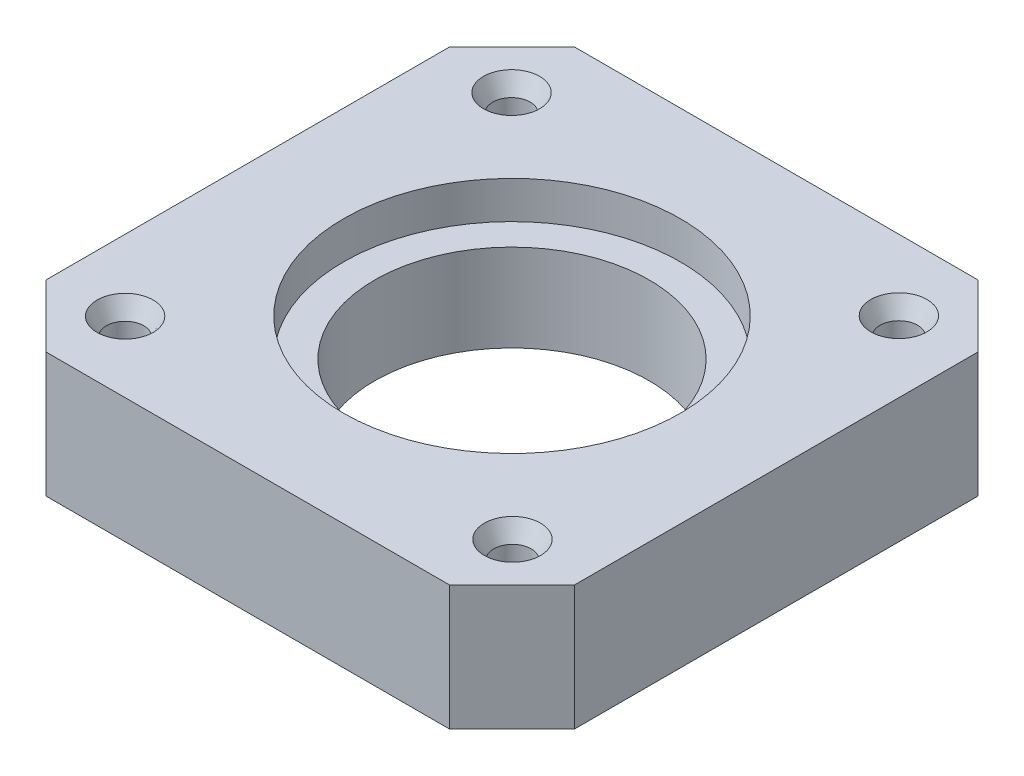
ISO-10303-21;
HEADER;
FILE_DESCRIPTION(('STEP AP214'),'2;1');
FILE_NAME('part.step','',(''),(''),'','','');
FILE_SCHEMA(('AUTOMOTIVE_DESIGN { 1 0 10303 214 1 1 1 1 }'));
ENDSEC;
DATA;
#1=APPLICATION_CONTEXT('core data for automotive mechanical design processes');
#2=APPLICATION_PROTOCOL_DEFINITION('international standard','automotive_design',2000,#1);
#3=PRODUCT_CONTEXT('',#1,'mechanical');
#4=PRODUCT('Part','Part','',(#3));
#5=PRODUCT_RELATED_PRODUCT_CATEGORY('part','',(#4));
#6=PRODUCT_DEFINITION_FORMATION('','',#4);
#7=PRODUCT_DEFINITION_CONTEXT('part definition',#1,'design');
#8=PRODUCT_DEFINITION('design','',#6,#7);
#9=PRODUCT_DEFINITION_SHAPE('','',#8);
#10=(LENGTH_UNIT() NAMED_UNIT(*) SI_UNIT(.MILLI.,.METRE.));
#11=(NAMED_UNIT(*) PLANE_ANGLE_UNIT() SI_UNIT($,.RADIAN.));
#12=(NAMED_UNIT(*) SI_UNIT($,.STERADIAN.) SOLID_ANGLE_UNIT());
#13=UNCERTAINTY_MEASURE_WITH_UNIT(LENGTH_MEASURE(1.E-05),#10,'distance_accuracy_value','');
#14=(GEOMETRIC_REPRESENTATION_CONTEXT(3) GLOBAL_UNCERTAINTY_ASSIGNED_CONTEXT((#13)) GLOBAL_UNIT_ASSIGNED_CONTEXT((#10,
#11,#12)) REPRESENTATION_CONTEXT('',''));
#15=CARTESIAN_POINT('',(0.,0.,0.));
#16=DIRECTION('',(0.,0.,1.));
#17=DIRECTION('',(1.,0.,0.));
#18=AXIS2_PLACEMENT_3D('',#15,#16,#17);
#19=CARTESIAN_POINT('',(0.,10.,0.));
#20=DIRECTION('',(0.,-1.,0.));
#21=DIRECTION('',(0.,0.,-1.));
#22=AXIS2_PLACEMENT_3D('',#19,#20,#21);
#23=CYLINDRICAL_SURFACE('',#22,11.);
#24=CARTESIAN_POINT('',(0.,0.,0.));
#25=DIRECTION('',(0.,1.,0.));
#26=DIRECTION('',(0.,0.,1.));
#27=AXIS2_PLACEMENT_3D('',#24,#25,#26);
#28=CIRCLE('',#27,11.);
#29=CARTESIAN_POINT('',(0.,0.,11.));
#30=VERTEX_POINT('',#29);
#31=EDGE_CURVE('E11',#30,#30,#28,.T.);
#32=ORIENTED_EDGE('',*,*,#31,.F.);
#33=EDGE_LOOP('',(#32));
#34=FACE_BOUND('',#33,.T.);
#35=CARTESIAN_POINT('',(0.,7.,0.));
#36=DIRECTION('',(0.,1.,0.));
#37=DIRECTION('',(0.,0.,1.));
#38=AXIS2_PLACEMENT_3D('',#35,#36,#37);
#39=CIRCLE('',#38,11.);
#40=CARTESIAN_POINT('',(0.,7.,11.));
#41=VERTEX_POINT('',#40);
#42=EDGE_CURVE('E35',#41,#41,#39,.T.);
#43=ORIENTED_EDGE('',*,*,#42,.T.);
#44=EDGE_LOOP('',(#43));
#45=FACE_BOUND('',#44,.T.);
#46=ADVANCED_FACE('F31',(#34,#45),#23,.F.);
#47=CARTESIAN_POINT('',(0.,10.,0.));
#48=DIRECTION('',(0.,1.,0.));
#49=DIRECTION('',(0.,0.,1.));
#50=AXIS2_PLACEMENT_3D('',#47,#48,#49);
#51=PLANE('',#50);
#52=CARTESIAN_POINT('',(0.,10.,0.));
#53=DIRECTION('',(0.,1.,0.));
#54=DIRECTION('',(0.,0.,1.));
#55=AXIS2_PLACEMENT_3D('',#52,#53,#54);
#56=CIRCLE('',#55,13.5);
#57=CARTESIAN_POINT('',(0.,10.,13.5));
#58=VERTEX_POINT('',#57);
#59=EDGE_CURVE('E192',#58,#58,#56,.T.);
#60=ORIENTED_EDGE('',*,*,#59,.F.);
#61=EDGE_LOOP('',(#60));
#62=FACE_BOUND('',#61,.T.);
#63=CARTESIAN_POINT('',(15.5184395783335,10.,15.4815384588745));
#64=DIRECTION('',(0.,1.,0.));
#65=DIRECTION('',(0.,0.,1.));
#66=AXIS2_PLACEMENT_3D('',#63,#64,#65);
#67=CIRCLE('',#66,2.25);
#68=CARTESIAN_POINT('',(15.5184395783335,10.,17.7315384588745));
#69=VERTEX_POINT('',#68);
#70=EDGE_CURVE('E180',#69,#69,#67,.T.);
#71=ORIENTED_EDGE('',*,*,#70,.F.);
#72=EDGE_LOOP('',(#71));
#73=FACE_BOUND('',#72,.T.);
#74=CARTESIAN_POINT('',(15.4815384588745,10.,-15.5184395783335));
#75=DIRECTION('',(0.,1.,0.));
#76=DIRECTION('',(0.,0.,1.));
#77=AXIS2_PLACEMENT_3D('',#74,#75,#76);
#78=CIRCLE('',#77,2.25);
#79=CARTESIAN_POINT('',(15.4815384588745,10.,-13.2684395783335));
#80=VERTEX_POINT('',#79);
#81=EDGE_CURVE('E177',#80,#80,#78,.T.);
#82=ORIENTED_EDGE('',*,*,#81,.F.);
#83=EDGE_LOOP('',(#82));
#84=FACE_BOUND('',#83,.T.);
#85=CARTESIAN_POINT('',(-15.4815384588745,10.,15.5184395783335));
#86=DIRECTION('',(0.,1.,0.));
#87=DIRECTION('',(0.,0.,1.));
#88=AXIS2_PLACEMENT_3D('',#85,#86,#87);
#89=CIRCLE('',#88,2.25);
#90=CARTESIAN_POINT('',(-15.4815384588745,10.,17.7684395783335));
#91=VERTEX_POINT('',#90);
#92=EDGE_CURVE('E174',#91,#91,#89,.T.);
#93=ORIENTED_EDGE('',*,*,#92,.F.);
#94=EDGE_LOOP('',(#93));
#95=FACE_BOUND('',#94,.T.);
#96=CARTESIAN_POINT('',(-15.5184395783335,10.,-15.4815384588745));
#97=DIRECTION('',(0.,1.,0.));
#98=DIRECTION('',(0.,0.,1.));
#99=AXIS2_PLACEMENT_3D('',#96,#97,#98);
#100=CIRCLE('',#99,2.25);
#101=CARTESIAN_POINT('',(-15.5184395783335,10.,-13.2315384588745));
#102=VERTEX_POINT('',#101);
#103=EDGE_CURVE('E170',#102,#102,#100,.T.);
#104=ORIENTED_EDGE('',*,*,#103,.F.);
#105=EDGE_LOOP('',(#104));
#106=FACE_BOUND('',#105,.T.);
#107=DIRECTION('',(-0.707106781186548,0.,-0.707106781186548));
#108=VECTOR('',#107,1.);
#109=CARTESIAN_POINT('',(-21.169262219769,10.,16.169262219769));
#110=LINE('',#109,#108);
#111=CARTESIAN_POINT('',(-16.169262219769,10.,21.169262219769));
#112=VERTEX_POINT('',#111);
#113=CARTESIAN_POINT('',(-21.1692622197689,10.,16.169262219769));
#114=VERTEX_POINT('',#113);
#115=EDGE_CURVE('E115',#112,#114,#110,.T.);
#116=ORIENTED_EDGE('',*,*,#115,.F.);
#117=DIRECTION('',(-1.,0.,0.));
#118=VECTOR('',#117,1.);
#119=CARTESIAN_POINT('',(-16.169262219769,10.,21.169262219769));
#120=LINE('',#119,#118);
#121=CARTESIAN_POINT('',(16.169262219769,10.,21.169262219769));
#122=VERTEX_POINT('',#121);
#123=EDGE_CURVE('E48',#122,#112,#120,.T.);
#124=ORIENTED_EDGE('',*,*,#123,.F.);
#125=DIRECTION('',(-0.707106781186548,0.,0.707106781186548));
#126=VECTOR('',#125,1.);
#127=CARTESIAN_POINT('',(16.169262219769,10.,21.169262219769));
#128=LINE('',#127,#126);
#129=CARTESIAN_POINT('',(21.169262219769,10.,16.169262219769));
#130=VERTEX_POINT('',#129);
#131=EDGE_CURVE('E131',#130,#122,#128,.T.);
#132=ORIENTED_EDGE('',*,*,#131,.F.);
#133=DIRECTION('',(0.,0.,1.));
#134=VECTOR('',#133,1.);
#135=CARTESIAN_POINT('',(21.169262219769,10.,-16.169262219769));
#136=LINE('',#135,#134);
#137=CARTESIAN_POINT('',(21.169262219769,10.,-16.169262219769));
#138=VERTEX_POINT('',#137);
#139=EDGE_CURVE('E128',#138,#130,#136,.T.);
#140=ORIENTED_EDGE('',*,*,#139,.F.);
#141=DIRECTION('',(0.707106781186548,0.,0.707106781186548));
#142=VECTOR('',#141,1.);
#143=CARTESIAN_POINT('',(16.169262219769,10.,-21.169262219769));
#144=LINE('',#143,#142);
#145=CARTESIAN_POINT('',(16.169262219769,10.,-21.169262219769));
#146=VERTEX_POINT('',#145);
#147=EDGE_CURVE('E122',#146,#138,#144,.T.);
#148=ORIENTED_EDGE('',*,*,#147,.F.);
#149=DIRECTION('',(1.,0.,0.));
#150=VECTOR('',#149,1.);
#151=CARTESIAN_POINT('',(-16.169262219769,10.,-21.169262219769));
#152=LINE('',#151,#150);
#153=CARTESIAN_POINT('',(-16.169262219769,10.,-21.169262219769));
#154=VERTEX_POINT('',#153);
#155=EDGE_CURVE('E120',#154,#146,#152,.T.);
#156=ORIENTED_EDGE('',*,*,#155,.F.);
#157=DIRECTION('',(0.707106781186548,0.,-0.707106781186548));
#158=VECTOR('',#157,1.);
#159=CARTESIAN_POINT('',(-16.169262219769,10.,-21.169262219769));
#160=LINE('',#159,#158);
#161=CARTESIAN_POINT('',(-21.169262219769,10.,-16.169262219769));
#162=VERTEX_POINT('',#161);
#163=EDGE_CURVE('E102',#162,#154,#160,.T.);
#164=ORIENTED_EDGE('',*,*,#163,.F.);
#165=DIRECTION('',(0.,0.,-1.));
#166=VECTOR('',#165,1.);
#167=CARTESIAN_POINT('',(-21.169262219769,10.,-16.169262219769));
#168=LINE('',#167,#166);
#169=EDGE_CURVE('E110',#114,#162,#168,.T.);
#170=ORIENTED_EDGE('',*,*,#169,.F.);
#171=EDGE_LOOP('',(#116,#124,#132,#140,#148,#156,#164,#170));
#172=FACE_BOUND('',#171,.T.);
#173=ADVANCED_FACE('F117',(#62,#73,#84,#95,#106,#172),#51,.T.);
#174=CARTESIAN_POINT('',(0.,0.,0.));
#175=DIRECTION('',(0.,1.,0.));
#176=DIRECTION('',(0.,0.,1.));
#177=AXIS2_PLACEMENT_3D('',#174,#175,#176);
#178=PLANE('',#177);
#179=CARTESIAN_POINT('',(15.5184395783335,0.,15.4815384588745));
#180=DIRECTION('',(0.,1.,0.));
#181=DIRECTION('',(0.,0.,1.));
#182=AXIS2_PLACEMENT_3D('',#179,#180,#181);
#183=CIRCLE('',#182,1.5);
#184=CARTESIAN_POINT('',(15.5184395783335,0.,16.9815384588745));
#185=VERTEX_POINT('',#184);
#186=EDGE_CURVE('E169',#185,#185,#183,.T.);
#187=ORIENTED_EDGE('',*,*,#186,.T.);
#188=EDGE_LOOP('',(#187));
#189=FACE_BOUND('',#188,.T.);
#190=CARTESIAN_POINT('',(15.4815384588745,0.,-15.5184395783335));
#191=DIRECTION('',(0.,1.,0.));
#192=DIRECTION('',(0.,0.,1.));
#193=AXIS2_PLACEMENT_3D('',#190,#191,#192);
#194=CIRCLE('',#193,1.5);
#195=CARTESIAN_POINT('',(15.4815384588745,0.,-14.0184395783335));
#196=VERTEX_POINT('',#195);
#197=EDGE_CURVE('E201',#196,#196,#194,.T.);
#198=ORIENTED_EDGE('',*,*,#197,.T.);
#199=EDGE_LOOP('',(#198));
#200=FACE_BOUND('',#199,.T.);
#201=CARTESIAN_POINT('',(-15.4815384588745,0.,15.5184395783335));
#202=DIRECTION('',(0.,1.,0.));
#203=DIRECTION('',(0.,0.,1.));
#204=AXIS2_PLACEMENT_3D('',#201,#202,#203);
#205=CIRCLE('',#204,1.5);
#206=CARTESIAN_POINT('',(-15.4815384588745,0.,17.0184395783335));
#207=VERTEX_POINT('',#206);
#208=EDGE_CURVE('E204',#207,#207,#205,.T.);
#209=ORIENTED_EDGE('',*,*,#208,.T.);
#210=EDGE_LOOP('',(#209));
#211=FACE_BOUND('',#210,.T.);
#212=CARTESIAN_POINT('',(-15.5184395783335,0.,-15.4815384588745));
#213=DIRECTION('',(0.,1.,0.));
#214=DIRECTION('',(0.,0.,1.));
#215=AXIS2_PLACEMENT_3D('',#212,#213,#214);
#216=CIRCLE('',#215,1.5);
#217=CARTESIAN_POINT('',(-15.5184395783335,0.,-13.9815384588745));
#218=VERTEX_POINT('',#217);
#219=EDGE_CURVE('E139',#218,#218,#216,.T.);
#220=ORIENTED_EDGE('',*,*,#219,.T.);
#221=EDGE_LOOP('',(#220));
#222=FACE_BOUND('',#221,.T.);
#223=ORIENTED_EDGE('',*,*,#31,.T.);
#224=EDGE_LOOP('',(#223));
#225=FACE_BOUND('',#224,.T.);
#226=DIRECTION('',(-1.,0.,0.));
#227=VECTOR('',#226,1.);
#228=CARTESIAN_POINT('',(-16.169262219769,0.,21.169262219769));
#229=LINE('',#228,#227);
#230=CARTESIAN_POINT('',(16.169262219769,0.,21.169262219769));
#231=VERTEX_POINT('',#230);
#232=CARTESIAN_POINT('',(-16.169262219769,0.,21.1692622197689));
#233=VERTEX_POINT('',#232);
#234=EDGE_CURVE('E135',#231,#233,#229,.T.);
#235=ORIENTED_EDGE('',*,*,#234,.T.);
#236=DIRECTION('',(-0.707106781186548,0.,-0.707106781186548));
#237=VECTOR('',#236,1.);
#238=CARTESIAN_POINT('',(-21.169262219769,0.,16.169262219769));
#239=LINE('',#238,#237);
#240=CARTESIAN_POINT('',(-21.169262219769,0.,16.169262219769));
#241=VERTEX_POINT('',#240);
#242=EDGE_CURVE('E138',#233,#241,#239,.T.);
#243=ORIENTED_EDGE('',*,*,#242,.T.);
#244=DIRECTION('',(0.,0.,-1.));
#245=VECTOR('',#244,1.);
#246=CARTESIAN_POINT('',(-21.169262219769,0.,-16.169262219769));
#247=LINE('',#246,#245);
#248=CARTESIAN_POINT('',(-21.169262219769,0.,-16.169262219769));
#249=VERTEX_POINT('',#248);
#250=EDGE_CURVE('E56',#241,#249,#247,.T.);
#251=ORIENTED_EDGE('',*,*,#250,.T.);
#252=DIRECTION('',(0.707106781186548,0.,-0.707106781186548));
#253=VECTOR('',#252,1.);
#254=CARTESIAN_POINT('',(-16.169262219769,0.,-21.169262219769));
#255=LINE('',#254,#253);
#256=CARTESIAN_POINT('',(-16.169262219769,0.,-21.169262219769));
#257=VERTEX_POINT('',#256);
#258=EDGE_CURVE('E105',#249,#257,#255,.T.);
#259=ORIENTED_EDGE('',*,*,#258,.T.);
#260=DIRECTION('',(1.,0.,0.));
#261=VECTOR('',#260,1.);
#262=CARTESIAN_POINT('',(-16.169262219769,0.,-21.169262219769));
#263=LINE('',#262,#261);
#264=CARTESIAN_POINT('',(16.169262219769,0.,-21.169262219769));
#265=VERTEX_POINT('',#264);
#266=EDGE_CURVE('E144',#257,#265,#263,.T.);
#267=ORIENTED_EDGE('',*,*,#266,.T.);
#268=DIRECTION('',(0.707106781186548,0.,0.707106781186548));
#269=VECTOR('',#268,1.);
#270=CARTESIAN_POINT('',(16.169262219769,0.,-21.169262219769));
#271=LINE('',#270,#269);
#272=CARTESIAN_POINT('',(21.169262219769,0.,-16.169262219769));
#273=VERTEX_POINT('',#272);
#274=EDGE_CURVE('E147',#265,#273,#271,.T.);
#275=ORIENTED_EDGE('',*,*,#274,.T.);
#276=DIRECTION('',(0.,0.,1.));
#277=VECTOR('',#276,1.);
#278=CARTESIAN_POINT('',(21.169262219769,0.,-16.169262219769));
#279=LINE('',#278,#277);
#280=CARTESIAN_POINT('',(21.169262219769,0.,16.169262219769));
#281=VERTEX_POINT('',#280);
#282=EDGE_CURVE('E150',#273,#281,#279,.T.);
#283=ORIENTED_EDGE('',*,*,#282,.T.);
#284=DIRECTION('',(-0.707106781186548,0.,0.707106781186548));
#285=VECTOR('',#284,1.);
#286=CARTESIAN_POINT('',(16.169262219769,0.,21.169262219769));
#287=LINE('',#286,#285);
#288=EDGE_CURVE('E153',#281,#231,#287,.T.);
#289=ORIENTED_EDGE('',*,*,#288,.T.);
#290=EDGE_LOOP('',(#235,#243,#251,#259,#267,#275,#283,#289));
#291=FACE_BOUND('',#290,.T.);
#292=ADVANCED_FACE('F33',(#189,#200,#211,#222,#225,#291),#178,.F.);
#293=CARTESIAN_POINT('',(-16.169262219769,10.,21.169262219769));
#294=DIRECTION('',(0.,0.,1.));
#295=DIRECTION('',(1.,0.,0.));
#296=AXIS2_PLACEMENT_3D('',#293,#294,#295);
#297=PLANE('',#296);
#298=ORIENTED_EDGE('',*,*,#234,.F.);
#299=DIRECTION('',(0.,-1.,0.));
#300=VECTOR('',#299,1.);
#301=CARTESIAN_POINT('',(16.169262219769,10.,21.169262219769));
#302=LINE('',#301,#300);
#303=EDGE_CURVE('E40',#122,#231,#302,.T.);
#304=ORIENTED_EDGE('',*,*,#303,.F.);
#305=ORIENTED_EDGE('',*,*,#123,.T.);
#306=DIRECTION('',(0.,-1.,0.));
#307=VECTOR('',#306,1.);
#308=CARTESIAN_POINT('',(-16.169262219769,10.,21.169262219769));
#309=LINE('',#308,#307);
#310=EDGE_CURVE('E134',#112,#233,#309,.T.);
#311=ORIENTED_EDGE('',*,*,#310,.T.);
#312=EDGE_LOOP('',(#298,#304,#305,#311));
#313=FACE_BOUND('',#312,.T.);
#314=ADVANCED_FACE('F228',(#313),#297,.T.);
#315=CARTESIAN_POINT('',(16.169262219769,10.,21.169262219769));
#316=DIRECTION('',(0.707106781186548,0.,0.707106781186548));
#317=DIRECTION('',(0.707106781186548,0.,-0.707106781186548));
#318=AXIS2_PLACEMENT_3D('',#315,#316,#317);
#319=PLANE('',#318);
#320=ORIENTED_EDGE('',*,*,#288,.F.);
#321=DIRECTION('',(0.,-1.,0.));
#322=VECTOR('',#321,1.);
#323=CARTESIAN_POINT('',(21.169262219769,10.,16.169262219769));
#324=LINE('',#323,#322);
#325=EDGE_CURVE('E157',#130,#281,#324,.T.);
#326=ORIENTED_EDGE('',*,*,#325,.F.);
#327=ORIENTED_EDGE('',*,*,#131,.T.);
#328=ORIENTED_EDGE('',*,*,#303,.T.);
#329=EDGE_LOOP('',(#320,#326,#327,#328));
#330=FACE_BOUND('',#329,.T.);
#331=ADVANCED_FACE('F216',(#330),#319,.T.);
#332=CARTESIAN_POINT('',(21.169262219769,10.,-16.169262219769));
#333=DIRECTION('',(1.,0.,0.));
#334=DIRECTION('',(0.,0.,-1.));
#335=AXIS2_PLACEMENT_3D('',#332,#333,#334);
#336=PLANE('',#335);
#337=ORIENTED_EDGE('',*,*,#282,.F.);
#338=DIRECTION('',(0.,-1.,0.));
#339=VECTOR('',#338,1.);
#340=CARTESIAN_POINT('',(21.169262219769,10.,-16.169262219769));
#341=LINE('',#340,#339);
#342=EDGE_CURVE('E159',#138,#273,#341,.T.);
#343=ORIENTED_EDGE('',*,*,#342,.F.);
#344=ORIENTED_EDGE('',*,*,#139,.T.);
#345=ORIENTED_EDGE('',*,*,#325,.T.);
#346=EDGE_LOOP('',(#337,#343,#344,#345));
#347=FACE_BOUND('',#346,.T.);
#348=ADVANCED_FACE('F220',(#347),#336,.T.);
#349=CARTESIAN_POINT('',(16.169262219769,10.,-21.169262219769));
#350=DIRECTION('',(0.707106781186548,0.,-0.707106781186548));
#351=DIRECTION('',(-0.707106781186548,0.,-0.707106781186548));
#352=AXIS2_PLACEMENT_3D('',#349,#350,#351);
#353=PLANE('',#352);
#354=ORIENTED_EDGE('',*,*,#274,.F.);
#355=DIRECTION('',(0.,-1.,0.));
#356=VECTOR('',#355,1.);
#357=CARTESIAN_POINT('',(16.169262219769,10.,-21.169262219769));
#358=LINE('',#357,#356);
#359=EDGE_CURVE('E161',#146,#265,#358,.T.);
#360=ORIENTED_EDGE('',*,*,#359,.F.);
#361=ORIENTED_EDGE('',*,*,#147,.T.);
#362=ORIENTED_EDGE('',*,*,#342,.T.);
#363=EDGE_LOOP('',(#354,#360,#361,#362));
#364=FACE_BOUND('',#363,.T.);
#365=ADVANCED_FACE('F223',(#364),#353,.T.);
#366=CARTESIAN_POINT('',(-16.169262219769,10.,-21.169262219769));
#367=DIRECTION('',(0.,0.,-1.));
#368=DIRECTION('',(-1.,0.,0.));
#369=AXIS2_PLACEMENT_3D('',#366,#367,#368);
#370=PLANE('',#369);
#371=ORIENTED_EDGE('',*,*,#266,.F.);
#372=DIRECTION('',(0.,-1.,0.));
#373=VECTOR('',#372,1.);
#374=CARTESIAN_POINT('',(-16.169262219769,10.,-21.169262219769));
#375=LINE('',#374,#373);
#376=EDGE_CURVE('E106',#154,#257,#375,.T.);
#377=ORIENTED_EDGE('',*,*,#376,.F.);
#378=ORIENTED_EDGE('',*,*,#155,.T.);
#379=ORIENTED_EDGE('',*,*,#359,.T.);
#380=EDGE_LOOP('',(#371,#377,#378,#379));
#381=FACE_BOUND('',#380,.T.);
#382=ADVANCED_FACE('F226',(#381),#370,.T.);
#383=CARTESIAN_POINT('',(-16.169262219769,10.,-21.169262219769));
#384=DIRECTION('',(-0.707106781186548,0.,-0.707106781186548));
#385=DIRECTION('',(-0.707106781186548,0.,0.707106781186548));
#386=AXIS2_PLACEMENT_3D('',#383,#384,#385);
#387=PLANE('',#386);
#388=ORIENTED_EDGE('',*,*,#258,.F.);
#389=DIRECTION('',(0.,-1.,0.));
#390=VECTOR('',#389,1.);
#391=CARTESIAN_POINT('',(-21.169262219769,10.,-16.169262219769));
#392=LINE('',#391,#390);
#393=EDGE_CURVE('E98',#162,#249,#392,.T.);
#394=ORIENTED_EDGE('',*,*,#393,.F.);
#395=ORIENTED_EDGE('',*,*,#163,.T.);
#396=ORIENTED_EDGE('',*,*,#376,.T.);
#397=EDGE_LOOP('',(#388,#394,#395,#396));
#398=FACE_BOUND('',#397,.T.);
#399=ADVANCED_FACE('F100',(#398),#387,.T.);
#400=CARTESIAN_POINT('',(-21.169262219769,10.,-16.169262219769));
#401=DIRECTION('',(-1.,0.,0.));
#402=DIRECTION('',(0.,0.,1.));
#403=AXIS2_PLACEMENT_3D('',#400,#401,#402);
#404=PLANE('',#403);
#405=ORIENTED_EDGE('',*,*,#250,.F.);
#406=DIRECTION('',(0.,-1.,0.));
#407=VECTOR('',#406,1.);
#408=CARTESIAN_POINT('',(-21.169262219769,10.,16.169262219769));
#409=LINE('',#408,#407);
#410=EDGE_CURVE('E107',#114,#241,#409,.T.);
#411=ORIENTED_EDGE('',*,*,#410,.F.);
#412=ORIENTED_EDGE('',*,*,#169,.T.);
#413=ORIENTED_EDGE('',*,*,#393,.T.);
#414=EDGE_LOOP('',(#405,#411,#412,#413));
#415=FACE_BOUND('',#414,.T.);
#416=ADVANCED_FACE('F111',(#415),#404,.T.);
#417=CARTESIAN_POINT('',(-21.169262219769,10.,16.169262219769));
#418=DIRECTION('',(-0.707106781186548,0.,0.707106781186548));
#419=DIRECTION('',(0.707106781186548,0.,0.707106781186548));
#420=AXIS2_PLACEMENT_3D('',#417,#418,#419);
#421=PLANE('',#420);
#422=ORIENTED_EDGE('',*,*,#242,.F.);
#423=ORIENTED_EDGE('',*,*,#310,.F.);
#424=ORIENTED_EDGE('',*,*,#115,.T.);
#425=ORIENTED_EDGE('',*,*,#410,.T.);
#426=EDGE_LOOP('',(#422,#423,#424,#425));
#427=FACE_BOUND('',#426,.T.);
#428=ADVANCED_FACE('F211',(#427),#421,.T.);
#429=CARTESIAN_POINT('',(-15.5184395783335,0.,-15.4815384588745));
#430=DIRECTION('',(0.,1.,0.));
#431=DIRECTION('',(0.,0.,1.));
#432=AXIS2_PLACEMENT_3D('',#429,#430,#431);
#433=CYLINDRICAL_SURFACE('',#432,1.5);
#434=CARTESIAN_POINT('',(-15.5184395783335,8.58945515099025,-15.4815384588745));
#435=DIRECTION('',(0.,1.,0.));
#436=DIRECTION('',(0.,0.,1.));
#437=AXIS2_PLACEMENT_3D('',#434,#435,#436);
#438=CIRCLE('',#437,1.5);
#439=CARTESIAN_POINT('',(-15.5184395783335,8.58945515099025,-13.9815384588745));
#440=VERTEX_POINT('',#439);
#441=EDGE_CURVE('E166',#440,#440,#438,.T.);
#442=ORIENTED_EDGE('',*,*,#441,.T.);
#443=EDGE_LOOP('',(#442));
#444=FACE_BOUND('',#443,.T.);
#445=ORIENTED_EDGE('',*,*,#219,.F.);
#446=EDGE_LOOP('',(#445));
#447=FACE_BOUND('',#446,.T.);
#448=ADVANCED_FACE('F276',(#444,#447),#433,.F.);
#449=CARTESIAN_POINT('',(-15.4815384588745,0.,15.5184395783335));
#450=DIRECTION('',(0.,1.,0.));
#451=DIRECTION('',(0.,0.,1.));
#452=AXIS2_PLACEMENT_3D('',#449,#450,#451);
#453=CYLINDRICAL_SURFACE('',#452,1.5);
#454=CARTESIAN_POINT('',(-15.4815384588745,8.58945515099025,15.5184395783335));
#455=DIRECTION('',(0.,1.,0.));
#456=DIRECTION('',(0.,0.,1.));
#457=AXIS2_PLACEMENT_3D('',#454,#455,#456);
#458=CIRCLE('',#457,1.5);
#459=CARTESIAN_POINT('',(-15.4815384588745,8.58945515099025,17.0184395783335));
#460=VERTEX_POINT('',#459);
#461=EDGE_CURVE('E171',#460,#460,#458,.T.);
#462=ORIENTED_EDGE('',*,*,#461,.T.);
#463=EDGE_LOOP('',(#462));
#464=FACE_BOUND('',#463,.T.);
#465=ORIENTED_EDGE('',*,*,#208,.F.);
#466=EDGE_LOOP('',(#465));
#467=FACE_BOUND('',#466,.T.);
#468=ADVANCED_FACE('F279',(#464,#467),#453,.F.);
#469=CARTESIAN_POINT('',(15.4815384588745,0.,-15.5184395783335));
#470=DIRECTION('',(0.,1.,0.));
#471=DIRECTION('',(0.,0.,1.));
#472=AXIS2_PLACEMENT_3D('',#469,#470,#471);
#473=CYLINDRICAL_SURFACE('',#472,1.5);
#474=CARTESIAN_POINT('',(15.4815384588745,8.58945515099024,-15.5184395783335));
#475=DIRECTION('',(0.,1.,0.));
#476=DIRECTION('',(0.,0.,1.));
#477=AXIS2_PLACEMENT_3D('',#474,#475,#476);
#478=CIRCLE('',#477,1.5);
#479=CARTESIAN_POINT('',(15.4815384588745,8.58945515099024,-14.0184395783335));
#480=VERTEX_POINT('',#479);
#481=EDGE_CURVE('E175',#480,#480,#478,.T.);
#482=ORIENTED_EDGE('',*,*,#481,.T.);
#483=EDGE_LOOP('',(#482));
#484=FACE_BOUND('',#483,.T.);
#485=ORIENTED_EDGE('',*,*,#197,.F.);
#486=EDGE_LOOP('',(#485));
#487=FACE_BOUND('',#486,.T.);
#488=ADVANCED_FACE('F288',(#484,#487),#473,.F.);
#489=CARTESIAN_POINT('',(15.5184395783335,0.,15.4815384588745));
#490=DIRECTION('',(0.,1.,0.));
#491=DIRECTION('',(0.,0.,1.));
#492=AXIS2_PLACEMENT_3D('',#489,#490,#491);
#493=CYLINDRICAL_SURFACE('',#492,1.5);
#494=CARTESIAN_POINT('',(15.5184395783335,8.58945515099024,15.4815384588745));
#495=DIRECTION('',(0.,1.,0.));
#496=DIRECTION('',(0.,0.,1.));
#497=AXIS2_PLACEMENT_3D('',#494,#495,#496);
#498=CIRCLE('',#497,1.5);
#499=CARTESIAN_POINT('',(15.5184395783335,8.58945515099024,16.9815384588745));
#500=VERTEX_POINT('',#499);
#501=EDGE_CURVE('E178',#500,#500,#498,.T.);
#502=ORIENTED_EDGE('',*,*,#501,.T.);
#503=EDGE_LOOP('',(#502));
#504=FACE_BOUND('',#503,.T.);
#505=ORIENTED_EDGE('',*,*,#186,.F.);
#506=EDGE_LOOP('',(#505));
#507=FACE_BOUND('',#506,.T.);
#508=ADVANCED_FACE('F272',(#504,#507),#493,.F.);
#509=CARTESIAN_POINT('',(-15.5184395783335,10.,-15.4815384588745));
#510=DIRECTION('',(0.,1.,0.));
#511=DIRECTION('',(0.,0.,1.));
#512=AXIS2_PLACEMENT_3D('',#509,#510,#511);
#513=CONICAL_SURFACE('',#512,2.25,0.488692190558413);
#514=ORIENTED_EDGE('',*,*,#103,.T.);
#515=EDGE_LOOP('',(#514));
#516=FACE_BOUND('',#515,.T.);
#517=ORIENTED_EDGE('',*,*,#441,.F.);
#518=EDGE_LOOP('',(#517));
#519=FACE_BOUND('',#518,.T.);
#520=ADVANCED_FACE('F268',(#516,#519),#513,.F.);
#521=CARTESIAN_POINT('',(-15.4815384588745,10.,15.5184395783335));
#522=DIRECTION('',(0.,1.,0.));
#523=DIRECTION('',(0.,0.,1.));
#524=AXIS2_PLACEMENT_3D('',#521,#522,#523);
#525=CONICAL_SURFACE('',#524,2.25,0.488692190558413);
#526=ORIENTED_EDGE('',*,*,#92,.T.);
#527=EDGE_LOOP('',(#526));
#528=FACE_BOUND('',#527,.T.);
#529=ORIENTED_EDGE('',*,*,#461,.F.);
#530=EDGE_LOOP('',(#529));
#531=FACE_BOUND('',#530,.T.);
#532=ADVANCED_FACE('F271',(#528,#531),#525,.F.);
#533=CARTESIAN_POINT('',(15.4815384588745,10.,-15.5184395783335));
#534=DIRECTION('',(0.,1.,0.));
#535=DIRECTION('',(0.,0.,1.));
#536=AXIS2_PLACEMENT_3D('',#533,#534,#535);
#537=CONICAL_SURFACE('',#536,2.25,0.488692190558413);
#538=ORIENTED_EDGE('',*,*,#81,.T.);
#539=EDGE_LOOP('',(#538));
#540=FACE_BOUND('',#539,.T.);
#541=ORIENTED_EDGE('',*,*,#481,.F.);
#542=EDGE_LOOP('',(#541));
#543=FACE_BOUND('',#542,.T.);
#544=ADVANCED_FACE('F358',(#540,#543),#537,.F.);
#545=CARTESIAN_POINT('',(15.5184395783335,10.,15.4815384588745));
#546=DIRECTION('',(0.,1.,0.));
#547=DIRECTION('',(0.,0.,1.));
#548=AXIS2_PLACEMENT_3D('',#545,#546,#547);
#549=CONICAL_SURFACE('',#548,2.25,0.488692190558413);
#550=ORIENTED_EDGE('',*,*,#70,.T.);
#551=EDGE_LOOP('',(#550));
#552=FACE_BOUND('',#551,.T.);
#553=ORIENTED_EDGE('',*,*,#501,.F.);
#554=EDGE_LOOP('',(#553));
#555=FACE_BOUND('',#554,.T.);
#556=ADVANCED_FACE('F368',(#552,#555),#549,.F.);
#557=CARTESIAN_POINT('',(0.,7.,0.));
#558=DIRECTION('',(0.,1.,0.));
#559=DIRECTION('',(0.,0.,1.));
#560=AXIS2_PLACEMENT_3D('',#557,#558,#559);
#561=CYLINDRICAL_SURFACE('',#560,13.5);
#562=CARTESIAN_POINT('',(0.,7.,0.));
#563=DIRECTION('',(0.,1.,0.));
#564=DIRECTION('',(0.,0.,1.));
#565=AXIS2_PLACEMENT_3D('',#562,#563,#564);
#566=CIRCLE('',#565,13.5);
#567=CARTESIAN_POINT('',(0.,7.,13.5));
#568=VERTEX_POINT('',#567);
#569=EDGE_CURVE('E190',#568,#568,#566,.T.);
#570=ORIENTED_EDGE('',*,*,#569,.F.);
#571=EDGE_LOOP('',(#570));
#572=FACE_BOUND('',#571,.T.);
#573=ORIENTED_EDGE('',*,*,#59,.T.);
#574=EDGE_LOOP('',(#573));
#575=FACE_BOUND('',#574,.T.);
#576=ADVANCED_FACE('F252',(#572,#575),#561,.F.);
#577=CARTESIAN_POINT('',(0.,7.,0.));
#578=DIRECTION('',(0.,1.,0.));
#579=DIRECTION('',(0.,0.,1.));
#580=AXIS2_PLACEMENT_3D('',#577,#578,#579);
#581=PLANE('',#580);
#582=ORIENTED_EDGE('',*,*,#42,.F.);
#583=EDGE_LOOP('',(#582));
#584=FACE_BOUND('',#583,.T.);
#585=ORIENTED_EDGE('',*,*,#569,.T.);
#586=EDGE_LOOP('',(#585));
#587=FACE_BOUND('',#586,.T.);
#588=ADVANCED_FACE('F249',(#584,#587),#581,.T.);
#589=CLOSED_SHELL('',(#46,#173,#292,#314,#331,#348,#365,#382,#399,#416,#428,#448,#468,#488,#508,
#520,#532,#544,#556,#576,#588));
#590=MANIFOLD_SOLID_BREP('B2',#589);
#591=ADVANCED_BREP_SHAPE_REPRESENTATION('',(#18,#590),#14);
#592=SHAPE_DEFINITION_REPRESENTATION(#9,#591);
ENDSEC;
END-ISO-10303-21;
